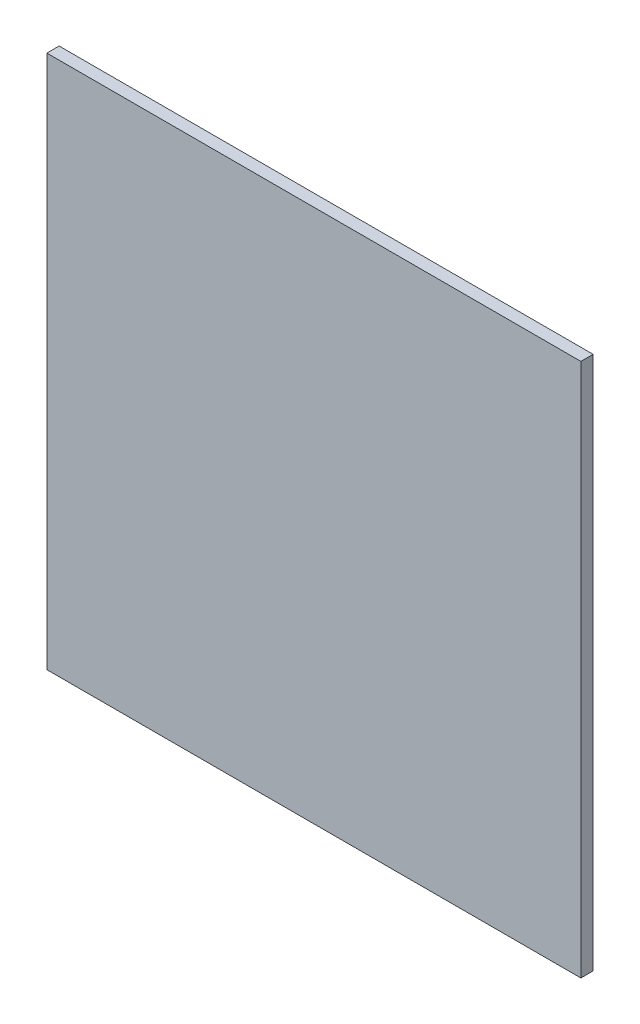
ISO-10303-21;
HEADER;
FILE_DESCRIPTION(('STEP AP214'),'2;1');
FILE_NAME('part.step','',(''),(''),'','','');
FILE_SCHEMA(('AUTOMOTIVE_DESIGN { 1 0 10303 214 1 1 1 1 }'));
ENDSEC;
DATA;
#1=APPLICATION_CONTEXT('core data for automotive mechanical design processes');
#2=APPLICATION_PROTOCOL_DEFINITION('international standard','automotive_design',2000,#1);
#3=PRODUCT_CONTEXT('',#1,'mechanical');
#4=PRODUCT('Part','Part','',(#3));
#5=PRODUCT_RELATED_PRODUCT_CATEGORY('part','',(#4));
#6=PRODUCT_DEFINITION_FORMATION('','',#4);
#7=PRODUCT_DEFINITION_CONTEXT('part definition',#1,'design');
#8=PRODUCT_DEFINITION('design','',#6,#7);
#9=PRODUCT_DEFINITION_SHAPE('','',#8);
#10=(LENGTH_UNIT() NAMED_UNIT(*) SI_UNIT(.MILLI.,.METRE.));
#11=(NAMED_UNIT(*) PLANE_ANGLE_UNIT() SI_UNIT($,.RADIAN.));
#12=(NAMED_UNIT(*) SI_UNIT($,.STERADIAN.) SOLID_ANGLE_UNIT());
#13=UNCERTAINTY_MEASURE_WITH_UNIT(LENGTH_MEASURE(1.E-05),#10,'distance_accuracy_value','');
#14=(GEOMETRIC_REPRESENTATION_CONTEXT(3) GLOBAL_UNCERTAINTY_ASSIGNED_CONTEXT((#13)) GLOBAL_UNIT_ASSIGNED_CONTEXT((#10,
#11,#12)) REPRESENTATION_CONTEXT('',''));
#15=CARTESIAN_POINT('',(0.,0.,0.));
#16=DIRECTION('',(0.,0.,1.));
#17=DIRECTION('',(1.,0.,0.));
#18=AXIS2_PLACEMENT_3D('',#15,#16,#17);
#19=CARTESIAN_POINT('',(67.5,-67.5,-3.1));
#20=DIRECTION('',(1.,0.,0.));
#21=DIRECTION('',(0.,0.,-1.));
#22=AXIS2_PLACEMENT_3D('',#19,#20,#21);
#23=PLANE('',#22);
#24=DIRECTION('',(0.,1.,0.));
#25=VECTOR('',#24,1.);
#26=CARTESIAN_POINT('',(67.5,-67.5,0.));
#27=LINE('',#26,#25);
#28=CARTESIAN_POINT('',(67.5,-67.5,0.));
#29=VERTEX_POINT('',#28);
#30=CARTESIAN_POINT('',(67.5,67.5,0.));
#31=VERTEX_POINT('',#30);
#32=EDGE_CURVE('E107',#29,#31,#27,.T.);
#33=ORIENTED_EDGE('',*,*,#32,.F.);
#34=DIRECTION('',(0.,0.,1.));
#35=VECTOR('',#34,1.);
#36=CARTESIAN_POINT('',(67.5,-67.5,-3.1));
#37=LINE('',#36,#35);
#38=CARTESIAN_POINT('',(67.5,-67.5,-3.1));
#39=VERTEX_POINT('',#38);
#40=EDGE_CURVE('E11',#39,#29,#37,.T.);
#41=ORIENTED_EDGE('',*,*,#40,.F.);
#42=DIRECTION('',(0.,1.,0.));
#43=VECTOR('',#42,1.);
#44=CARTESIAN_POINT('',(67.5,-67.5,-3.1));
#45=LINE('',#44,#43);
#46=CARTESIAN_POINT('',(67.5,67.5,-3.1));
#47=VERTEX_POINT('',#46);
#48=EDGE_CURVE('E100',#39,#47,#45,.T.);
#49=ORIENTED_EDGE('',*,*,#48,.T.);
#50=DIRECTION('',(0.,0.,1.));
#51=VECTOR('',#50,1.);
#52=CARTESIAN_POINT('',(67.5,67.5,-3.1));
#53=LINE('',#52,#51);
#54=EDGE_CURVE('E44',#47,#31,#53,.T.);
#55=ORIENTED_EDGE('',*,*,#54,.T.);
#56=EDGE_LOOP('',(#33,#41,#49,#55));
#57=FACE_BOUND('',#56,.T.);
#58=ADVANCED_FACE('F41',(#57),#23,.T.);
#59=CARTESIAN_POINT('',(-67.5,-67.5,-3.1));
#60=DIRECTION('',(0.,-1.,0.));
#61=DIRECTION('',(0.,0.,-1.));
#62=AXIS2_PLACEMENT_3D('',#59,#60,#61);
#63=PLANE('',#62);
#64=DIRECTION('',(1.,0.,0.));
#65=VECTOR('',#64,1.);
#66=CARTESIAN_POINT('',(-67.5,-67.5,0.));
#67=LINE('',#66,#65);
#68=CARTESIAN_POINT('',(-67.5,-67.5,0.));
#69=VERTEX_POINT('',#68);
#70=EDGE_CURVE('E103',#69,#29,#67,.T.);
#71=ORIENTED_EDGE('',*,*,#70,.F.);
#72=DIRECTION('',(0.,0.,1.));
#73=VECTOR('',#72,1.);
#74=CARTESIAN_POINT('',(-67.5,-67.5,-3.1));
#75=LINE('',#74,#73);
#76=CARTESIAN_POINT('',(-67.5,-67.5,-3.1));
#77=VERTEX_POINT('',#76);
#78=EDGE_CURVE('E50',#77,#69,#75,.T.);
#79=ORIENTED_EDGE('',*,*,#78,.F.);
#80=DIRECTION('',(1.,0.,0.));
#81=VECTOR('',#80,1.);
#82=CARTESIAN_POINT('',(-67.5,-67.5,-3.1));
#83=LINE('',#82,#81);
#84=EDGE_CURVE('E96',#77,#39,#83,.T.);
#85=ORIENTED_EDGE('',*,*,#84,.T.);
#86=ORIENTED_EDGE('',*,*,#40,.T.);
#87=EDGE_LOOP('',(#71,#79,#85,#86));
#88=FACE_BOUND('',#87,.T.);
#89=ADVANCED_FACE('F117',(#88),#63,.T.);
#90=CARTESIAN_POINT('',(-67.5,-67.5,-3.1));
#91=DIRECTION('',(-1.,0.,0.));
#92=DIRECTION('',(0.,0.,1.));
#93=AXIS2_PLACEMENT_3D('',#90,#91,#92);
#94=PLANE('',#93);
#95=DIRECTION('',(0.,-1.,0.));
#96=VECTOR('',#95,1.);
#97=CARTESIAN_POINT('',(-67.5,-67.5,0.));
#98=LINE('',#97,#96);
#99=CARTESIAN_POINT('',(-67.5,67.5,0.));
#100=VERTEX_POINT('',#99);
#101=EDGE_CURVE('E91',#100,#69,#98,.T.);
#102=ORIENTED_EDGE('',*,*,#101,.F.);
#103=DIRECTION('',(0.,0.,1.));
#104=VECTOR('',#103,1.);
#105=CARTESIAN_POINT('',(-67.5,67.5,-3.1));
#106=LINE('',#105,#104);
#107=CARTESIAN_POINT('',(-67.5,67.5,-3.1));
#108=VERTEX_POINT('',#107);
#109=EDGE_CURVE('E86',#108,#100,#106,.T.);
#110=ORIENTED_EDGE('',*,*,#109,.F.);
#111=DIRECTION('',(0.,-1.,0.));
#112=VECTOR('',#111,1.);
#113=CARTESIAN_POINT('',(-67.5,-67.5,-3.1));
#114=LINE('',#113,#112);
#115=EDGE_CURVE('E89',#108,#77,#114,.T.);
#116=ORIENTED_EDGE('',*,*,#115,.T.);
#117=ORIENTED_EDGE('',*,*,#78,.T.);
#118=EDGE_LOOP('',(#102,#110,#116,#117));
#119=FACE_BOUND('',#118,.T.);
#120=ADVANCED_FACE('F88',(#119),#94,.T.);
#121=CARTESIAN_POINT('',(-67.5,67.5,-3.1));
#122=DIRECTION('',(0.,1.,0.));
#123=DIRECTION('',(0.,0.,1.));
#124=AXIS2_PLACEMENT_3D('',#121,#122,#123);
#125=PLANE('',#124);
#126=DIRECTION('',(-1.,0.,0.));
#127=VECTOR('',#126,1.);
#128=CARTESIAN_POINT('',(-67.5,67.5,0.));
#129=LINE('',#128,#127);
#130=EDGE_CURVE('E110',#31,#100,#129,.T.);
#131=ORIENTED_EDGE('',*,*,#130,.F.);
#132=ORIENTED_EDGE('',*,*,#54,.F.);
#133=DIRECTION('',(-1.,0.,0.));
#134=VECTOR('',#133,1.);
#135=CARTESIAN_POINT('',(-67.5,67.5,-3.1));
#136=LINE('',#135,#134);
#137=EDGE_CURVE('E95',#47,#108,#136,.T.);
#138=ORIENTED_EDGE('',*,*,#137,.T.);
#139=ORIENTED_EDGE('',*,*,#109,.T.);
#140=EDGE_LOOP('',(#131,#132,#138,#139));
#141=FACE_BOUND('',#140,.T.);
#142=ADVANCED_FACE('F98',(#141),#125,.T.);
#143=CARTESIAN_POINT('',(0.,0.,-3.1));
#144=DIRECTION('',(0.,0.,-1.));
#145=DIRECTION('',(-1.,0.,0.));
#146=AXIS2_PLACEMENT_3D('',#143,#144,#145);
#147=PLANE('',#146);
#148=ORIENTED_EDGE('',*,*,#48,.F.);
#149=ORIENTED_EDGE('',*,*,#84,.F.);
#150=ORIENTED_EDGE('',*,*,#115,.F.);
#151=ORIENTED_EDGE('',*,*,#137,.F.);
#152=EDGE_LOOP('',(#148,#149,#150,#151));
#153=FACE_BOUND('',#152,.T.);
#154=ADVANCED_FACE('F94',(#153),#147,.T.);
#155=CARTESIAN_POINT('',(0.,0.,0.));
#156=DIRECTION('',(0.,0.,-1.));
#157=DIRECTION('',(-1.,0.,0.));
#158=AXIS2_PLACEMENT_3D('',#155,#156,#157);
#159=PLANE('',#158);
#160=ORIENTED_EDGE('',*,*,#32,.T.);
#161=ORIENTED_EDGE('',*,*,#130,.T.);
#162=ORIENTED_EDGE('',*,*,#101,.T.);
#163=ORIENTED_EDGE('',*,*,#70,.T.);
#164=EDGE_LOOP('',(#160,#161,#162,#163));
#165=FACE_BOUND('',#164,.T.);
#166=ADVANCED_FACE('F116',(#165),#159,.F.);
#167=CLOSED_SHELL('',(#58,#89,#120,#142,#154,#166));
#168=MANIFOLD_SOLID_BREP('B2',#167);
#169=ADVANCED_BREP_SHAPE_REPRESENTATION('',(#18,#168),#14);
#170=SHAPE_DEFINITION_REPRESENTATION(#9,#169);
ENDSEC;
END-ISO-10303-21;
